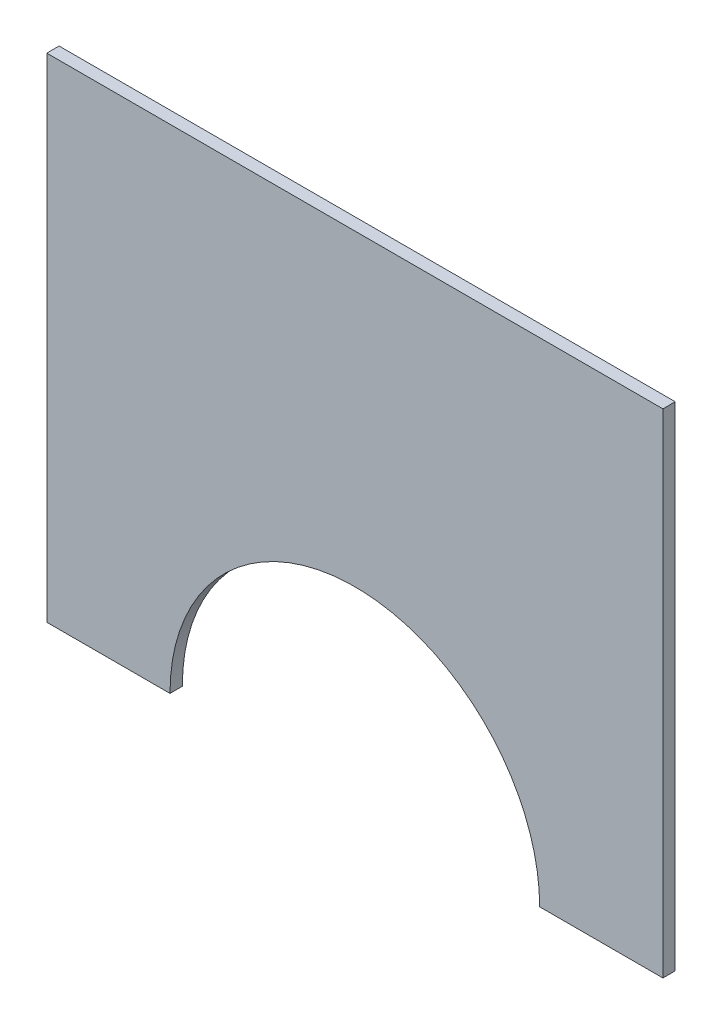
ISO-10303-21;
HEADER;
FILE_DESCRIPTION(('STEP AP214'),'2;1');
FILE_NAME('part.step','',(''),(''),'','','');
FILE_SCHEMA(('AUTOMOTIVE_DESIGN { 1 0 10303 214 1 1 1 1 }'));
ENDSEC;
DATA;
#1=APPLICATION_CONTEXT('core data for automotive mechanical design processes');
#2=APPLICATION_PROTOCOL_DEFINITION('international standard','automotive_design',2000,#1);
#3=PRODUCT_CONTEXT('',#1,'mechanical');
#4=PRODUCT('Part','Part','',(#3));
#5=PRODUCT_RELATED_PRODUCT_CATEGORY('part','',(#4));
#6=PRODUCT_DEFINITION_FORMATION('','',#4);
#7=PRODUCT_DEFINITION_CONTEXT('part definition',#1,'design');
#8=PRODUCT_DEFINITION('design','',#6,#7);
#9=PRODUCT_DEFINITION_SHAPE('','',#8);
#10=(LENGTH_UNIT() NAMED_UNIT(*) SI_UNIT(.MILLI.,.METRE.));
#11=(NAMED_UNIT(*) PLANE_ANGLE_UNIT() SI_UNIT($,.RADIAN.));
#12=(NAMED_UNIT(*) SI_UNIT($,.STERADIAN.) SOLID_ANGLE_UNIT());
#13=UNCERTAINTY_MEASURE_WITH_UNIT(LENGTH_MEASURE(1.E-05),#10,'distance_accuracy_value','');
#14=(GEOMETRIC_REPRESENTATION_CONTEXT(3) GLOBAL_UNCERTAINTY_ASSIGNED_CONTEXT((#13)) GLOBAL_UNIT_ASSIGNED_CONTEXT((#10,
#11,#12)) REPRESENTATION_CONTEXT('',''));
#15=CARTESIAN_POINT('',(0.,0.,0.));
#16=DIRECTION('',(0.,0.,1.));
#17=DIRECTION('',(1.,0.,0.));
#18=AXIS2_PLACEMENT_3D('',#15,#16,#17);
#19=CARTESIAN_POINT('',(0.6,-0.800000000000001,0.01));
#20=DIRECTION('',(0.,1.,0.));
#21=DIRECTION('',(-1.,0.,0.));
#22=AXIS2_PLACEMENT_3D('',#19,#20,#21);
#23=PLANE('',#22);
#24=DIRECTION('',(1.,0.,0.));
#25=VECTOR('',#24,1.);
#26=CARTESIAN_POINT('',(0.6,-0.800000000000001,0.));
#27=LINE('',#26,#25);
#28=CARTESIAN_POINT('',(0.6,-0.800000000000001,0.));
#29=VERTEX_POINT('',#28);
#30=CARTESIAN_POINT('',(0.7,-0.800000000000001,0.));
#31=VERTEX_POINT('',#30);
#32=EDGE_CURVE('E11',#29,#31,#27,.T.);
#33=ORIENTED_EDGE('',*,*,#32,.T.);
#34=DIRECTION('',(0.,0.,-1.));
#35=VECTOR('',#34,1.);
#36=CARTESIAN_POINT('',(0.7,-0.800000000000001,0.01));
#37=LINE('',#36,#35);
#38=CARTESIAN_POINT('',(0.7,-0.800000000000001,0.01));
#39=VERTEX_POINT('',#38);
#40=EDGE_CURVE('E24',#39,#31,#37,.T.);
#41=ORIENTED_EDGE('',*,*,#40,.F.);
#42=DIRECTION('',(1.,0.,0.));
#43=VECTOR('',#42,1.);
#44=CARTESIAN_POINT('',(0.6,-0.800000000000001,0.01));
#45=LINE('',#44,#43);
#46=CARTESIAN_POINT('',(0.6,-0.800000000000001,0.01));
#47=VERTEX_POINT('',#46);
#48=EDGE_CURVE('E116',#47,#39,#45,.T.);
#49=ORIENTED_EDGE('',*,*,#48,.F.);
#50=DIRECTION('',(0.,0.,-1.));
#51=VECTOR('',#50,1.);
#52=CARTESIAN_POINT('',(0.6,-0.800000000000001,0.01));
#53=LINE('',#52,#51);
#54=EDGE_CURVE('E90',#47,#29,#53,.T.);
#55=ORIENTED_EDGE('',*,*,#54,.T.);
#56=EDGE_LOOP('',(#33,#41,#49,#55));
#57=FACE_BOUND('',#56,.T.);
#58=ADVANCED_FACE('F17',(#57),#23,.F.);
#59=CARTESIAN_POINT('',(0.7,-0.800000000000001,0.01));
#60=DIRECTION('',(-1.,0.,0.));
#61=DIRECTION('',(0.,0.,1.));
#62=AXIS2_PLACEMENT_3D('',#59,#60,#61);
#63=PLANE('',#62);
#64=DIRECTION('',(0.,1.,0.));
#65=VECTOR('',#64,1.);
#66=CARTESIAN_POINT('',(0.7,-0.800000000000001,0.));
#67=LINE('',#66,#65);
#68=CARTESIAN_POINT('',(0.7,-0.400000000000001,0.));
#69=VERTEX_POINT('',#68);
#70=EDGE_CURVE('E113',#31,#69,#67,.T.);
#71=ORIENTED_EDGE('',*,*,#70,.T.);
#72=DIRECTION('',(0.,0.,-1.));
#73=VECTOR('',#72,1.);
#74=CARTESIAN_POINT('',(0.7,-0.400000000000001,0.01));
#75=LINE('',#74,#73);
#76=CARTESIAN_POINT('',(0.7,-0.400000000000001,0.01));
#77=VERTEX_POINT('',#76);
#78=EDGE_CURVE('E110',#77,#69,#75,.T.);
#79=ORIENTED_EDGE('',*,*,#78,.F.);
#80=DIRECTION('',(0.,1.,0.));
#81=VECTOR('',#80,1.);
#82=CARTESIAN_POINT('',(0.7,-0.800000000000001,0.01));
#83=LINE('',#82,#81);
#84=EDGE_CURVE('E107',#39,#77,#83,.T.);
#85=ORIENTED_EDGE('',*,*,#84,.F.);
#86=ORIENTED_EDGE('',*,*,#40,.T.);
#87=EDGE_LOOP('',(#71,#79,#85,#86));
#88=FACE_BOUND('',#87,.T.);
#89=ADVANCED_FACE('F119',(#88),#63,.F.);
#90=CARTESIAN_POINT('',(0.2,-0.400000000000001,0.01));
#91=DIRECTION('',(0.,-1.,0.));
#92=DIRECTION('',(0.,0.,-1.));
#93=AXIS2_PLACEMENT_3D('',#90,#91,#92);
#94=PLANE('',#93);
#95=DIRECTION('',(-1.,0.,0.));
#96=VECTOR('',#95,1.);
#97=CARTESIAN_POINT('',(0.2,-0.400000000000001,0.));
#98=LINE('',#97,#96);
#99=CARTESIAN_POINT('',(0.2,-0.400000000000001,0.));
#100=VERTEX_POINT('',#99);
#101=EDGE_CURVE('E105',#69,#100,#98,.T.);
#102=ORIENTED_EDGE('',*,*,#101,.T.);
#103=DIRECTION('',(0.,0.,-1.));
#104=VECTOR('',#103,1.);
#105=CARTESIAN_POINT('',(0.2,-0.400000000000001,0.01));
#106=LINE('',#105,#104);
#107=CARTESIAN_POINT('',(0.2,-0.400000000000001,0.01));
#108=VERTEX_POINT('',#107);
#109=EDGE_CURVE('E102',#108,#100,#106,.T.);
#110=ORIENTED_EDGE('',*,*,#109,.F.);
#111=DIRECTION('',(-1.,0.,0.));
#112=VECTOR('',#111,1.);
#113=CARTESIAN_POINT('',(0.2,-0.400000000000001,0.01));
#114=LINE('',#113,#112);
#115=EDGE_CURVE('E100',#77,#108,#114,.T.);
#116=ORIENTED_EDGE('',*,*,#115,.F.);
#117=ORIENTED_EDGE('',*,*,#78,.T.);
#118=EDGE_LOOP('',(#102,#110,#116,#117));
#119=FACE_BOUND('',#118,.T.);
#120=ADVANCED_FACE('F124',(#119),#94,.F.);
#121=CARTESIAN_POINT('',(0.2,-0.400000000000001,0.01));
#122=DIRECTION('',(1.,0.,0.));
#123=DIRECTION('',(0.,1.,0.));
#124=AXIS2_PLACEMENT_3D('',#121,#122,#123);
#125=PLANE('',#124);
#126=DIRECTION('',(0.,-1.,0.));
#127=VECTOR('',#126,1.);
#128=CARTESIAN_POINT('',(0.2,-0.400000000000001,0.));
#129=LINE('',#128,#127);
#130=CARTESIAN_POINT('',(0.2,-0.800000000000001,0.));
#131=VERTEX_POINT('',#130);
#132=EDGE_CURVE('E98',#100,#131,#129,.T.);
#133=ORIENTED_EDGE('',*,*,#132,.T.);
#134=DIRECTION('',(0.,0.,-1.));
#135=VECTOR('',#134,1.);
#136=CARTESIAN_POINT('',(0.2,-0.800000000000001,0.01));
#137=LINE('',#136,#135);
#138=CARTESIAN_POINT('',(0.2,-0.800000000000001,0.01));
#139=VERTEX_POINT('',#138);
#140=EDGE_CURVE('E96',#139,#131,#137,.T.);
#141=ORIENTED_EDGE('',*,*,#140,.F.);
#142=DIRECTION('',(0.,-1.,0.));
#143=VECTOR('',#142,1.);
#144=CARTESIAN_POINT('',(0.2,-0.400000000000001,0.01));
#145=LINE('',#144,#143);
#146=EDGE_CURVE('E85',#108,#139,#145,.T.);
#147=ORIENTED_EDGE('',*,*,#146,.F.);
#148=ORIENTED_EDGE('',*,*,#109,.T.);
#149=EDGE_LOOP('',(#133,#141,#147,#148));
#150=FACE_BOUND('',#149,.T.);
#151=ADVANCED_FACE('F127',(#150),#125,.F.);
#152=CARTESIAN_POINT('',(0.2,-0.800000000000001,0.01));
#153=DIRECTION('',(0.,1.,0.));
#154=DIRECTION('',(-1.,0.,0.));
#155=AXIS2_PLACEMENT_3D('',#152,#153,#154);
#156=PLANE('',#155);
#157=DIRECTION('',(1.,0.,0.));
#158=VECTOR('',#157,1.);
#159=CARTESIAN_POINT('',(0.2,-0.800000000000001,0.));
#160=LINE('',#159,#158);
#161=CARTESIAN_POINT('',(0.3,-0.800000000000001,0.));
#162=VERTEX_POINT('',#161);
#163=EDGE_CURVE('E72',#131,#162,#160,.T.);
#164=ORIENTED_EDGE('',*,*,#163,.T.);
#165=DIRECTION('',(0.,0.,-1.));
#166=VECTOR('',#165,1.);
#167=CARTESIAN_POINT('',(0.3,-0.800000000000001,0.01));
#168=LINE('',#167,#166);
#169=CARTESIAN_POINT('',(0.3,-0.800000000000001,0.01));
#170=VERTEX_POINT('',#169);
#171=EDGE_CURVE('E66',#170,#162,#168,.T.);
#172=ORIENTED_EDGE('',*,*,#171,.F.);
#173=DIRECTION('',(1.,0.,0.));
#174=VECTOR('',#173,1.);
#175=CARTESIAN_POINT('',(0.2,-0.800000000000001,0.01));
#176=LINE('',#175,#174);
#177=EDGE_CURVE('E70',#139,#170,#176,.T.);
#178=ORIENTED_EDGE('',*,*,#177,.F.);
#179=ORIENTED_EDGE('',*,*,#140,.T.);
#180=EDGE_LOOP('',(#164,#172,#178,#179));
#181=FACE_BOUND('',#180,.T.);
#182=ADVANCED_FACE('F68',(#181),#156,.F.);
#183=CARTESIAN_POINT('',(0.45,-0.800000000000001,0.01));
#184=DIRECTION('',(0.,0.,-1.));
#185=DIRECTION('',(-1.,0.,0.));
#186=AXIS2_PLACEMENT_3D('',#183,#184,#185);
#187=CYLINDRICAL_SURFACE('',#186,0.15);
#188=CARTESIAN_POINT('',(0.45,-0.800000000000001,0.));
#189=DIRECTION('',(0.,0.,-1.));
#190=DIRECTION('',(0.,-1.,0.));
#191=AXIS2_PLACEMENT_3D('',#188,#189,#190);
#192=CIRCLE('',#191,0.15);
#193=EDGE_CURVE('E86',#162,#29,#192,.T.);
#194=ORIENTED_EDGE('',*,*,#193,.T.);
#195=ORIENTED_EDGE('',*,*,#54,.F.);
#196=CARTESIAN_POINT('',(0.45,-0.800000000000001,0.01));
#197=DIRECTION('',(0.,0.,-1.));
#198=DIRECTION('',(0.,-1.,0.));
#199=AXIS2_PLACEMENT_3D('',#196,#197,#198);
#200=CIRCLE('',#199,0.15);
#201=EDGE_CURVE('E82',#170,#47,#200,.T.);
#202=ORIENTED_EDGE('',*,*,#201,.F.);
#203=ORIENTED_EDGE('',*,*,#171,.T.);
#204=EDGE_LOOP('',(#194,#195,#202,#203));
#205=FACE_BOUND('',#204,.T.);
#206=ADVANCED_FACE('F89',(#205),#187,.F.);
#207=CARTESIAN_POINT('',(0.45,-0.800000000000001,0.01));
#208=DIRECTION('',(0.,0.,-1.));
#209=DIRECTION('',(-1.,0.,0.));
#210=AXIS2_PLACEMENT_3D('',#207,#208,#209);
#211=PLANE('',#210);
#212=ORIENTED_EDGE('',*,*,#48,.T.);
#213=ORIENTED_EDGE('',*,*,#84,.T.);
#214=ORIENTED_EDGE('',*,*,#115,.T.);
#215=ORIENTED_EDGE('',*,*,#146,.T.);
#216=ORIENTED_EDGE('',*,*,#177,.T.);
#217=ORIENTED_EDGE('',*,*,#201,.T.);
#218=EDGE_LOOP('',(#212,#213,#214,#215,#216,#217));
#219=FACE_BOUND('',#218,.T.);
#220=ADVANCED_FACE('F81',(#219),#211,.F.);
#221=CARTESIAN_POINT('',(0.45,-0.800000000000001,0.));
#222=DIRECTION('',(0.,0.,-1.));
#223=DIRECTION('',(-1.,0.,0.));
#224=AXIS2_PLACEMENT_3D('',#221,#222,#223);
#225=PLANE('',#224);
#226=ORIENTED_EDGE('',*,*,#32,.F.);
#227=ORIENTED_EDGE('',*,*,#193,.F.);
#228=ORIENTED_EDGE('',*,*,#163,.F.);
#229=ORIENTED_EDGE('',*,*,#132,.F.);
#230=ORIENTED_EDGE('',*,*,#101,.F.);
#231=ORIENTED_EDGE('',*,*,#70,.F.);
#232=EDGE_LOOP('',(#226,#227,#228,#229,#230,#231));
#233=FACE_BOUND('',#232,.T.);
#234=ADVANCED_FACE('F121',(#233),#225,.T.);
#235=CLOSED_SHELL('',(#58,#89,#120,#151,#182,#206,#220,#234));
#236=MANIFOLD_SOLID_BREP('B1',#235);
#237=ADVANCED_BREP_SHAPE_REPRESENTATION('',(#18,#236),#14);
#238=SHAPE_DEFINITION_REPRESENTATION(#9,#237);
ENDSEC;
END-ISO-10303-21;
